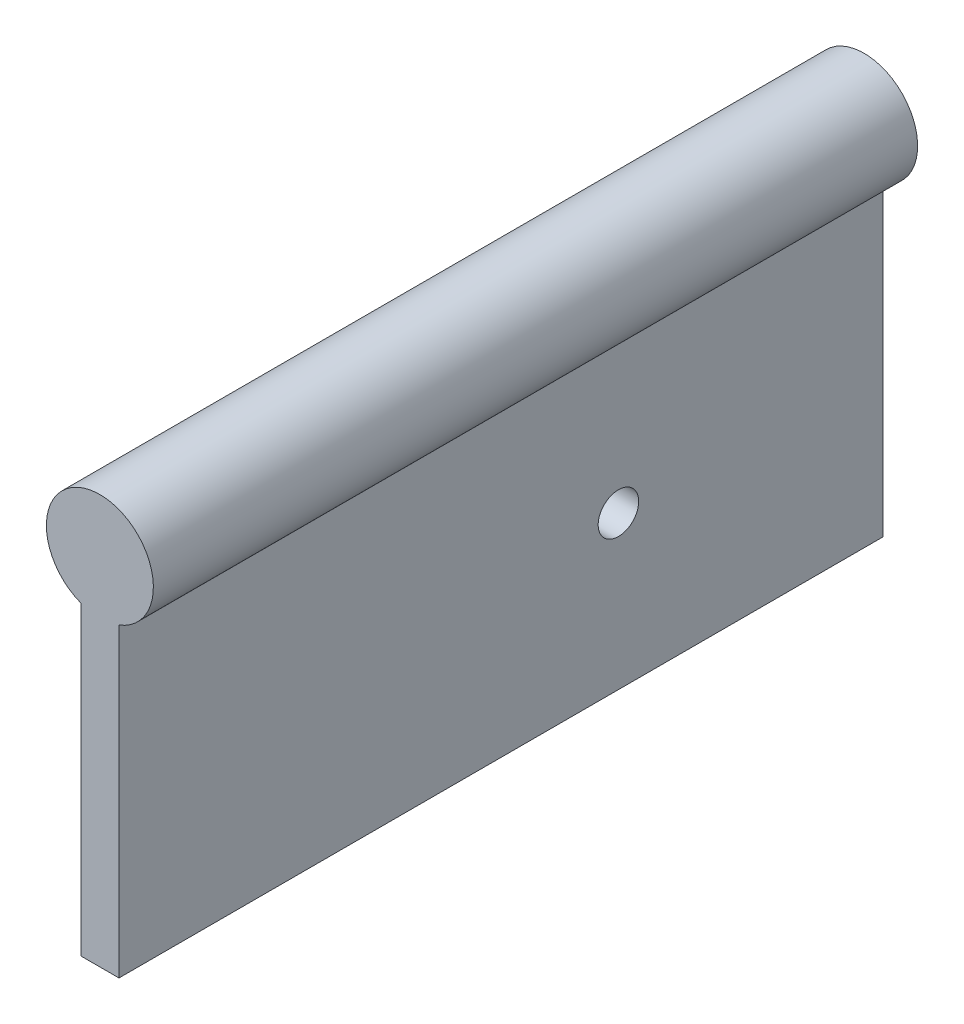
ISO-10303-21;
HEADER;
FILE_DESCRIPTION(('STEP AP214'),'2;1');
FILE_NAME('part.step','',(''),(''),'','','');
FILE_SCHEMA(('AUTOMOTIVE_DESIGN { 1 0 10303 214 1 1 1 1 }'));
ENDSEC;
DATA;
#1=APPLICATION_CONTEXT('core data for automotive mechanical design processes');
#2=APPLICATION_PROTOCOL_DEFINITION('international standard','automotive_design',2000,#1);
#3=PRODUCT_CONTEXT('',#1,'mechanical');
#4=PRODUCT('Part','Part','',(#3));
#5=PRODUCT_RELATED_PRODUCT_CATEGORY('part','',(#4));
#6=PRODUCT_DEFINITION_FORMATION('','',#4);
#7=PRODUCT_DEFINITION_CONTEXT('part definition',#1,'design');
#8=PRODUCT_DEFINITION('design','',#6,#7);
#9=PRODUCT_DEFINITION_SHAPE('','',#8);
#10=(LENGTH_UNIT() NAMED_UNIT(*) SI_UNIT(.MILLI.,.METRE.));
#11=(NAMED_UNIT(*) PLANE_ANGLE_UNIT() SI_UNIT($,.RADIAN.));
#12=(NAMED_UNIT(*) SI_UNIT($,.STERADIAN.) SOLID_ANGLE_UNIT());
#13=UNCERTAINTY_MEASURE_WITH_UNIT(LENGTH_MEASURE(1.E-05),#10,'distance_accuracy_value','');
#14=(GEOMETRIC_REPRESENTATION_CONTEXT(3) GLOBAL_UNCERTAINTY_ASSIGNED_CONTEXT((#13)) GLOBAL_UNIT_ASSIGNED_CONTEXT((#10,
#11,#12)) REPRESENTATION_CONTEXT('',''));
#15=CARTESIAN_POINT('',(0.,0.,0.));
#16=DIRECTION('',(0.,0.,1.));
#17=DIRECTION('',(1.,0.,0.));
#18=AXIS2_PLACEMENT_3D('',#15,#16,#17);
#19=CARTESIAN_POINT('',(5.,0.,-15.35));
#20=DIRECTION('',(-1.,0.,0.));
#21=DIRECTION('',(0.,0.,1.));
#22=AXIS2_PLACEMENT_3D('',#19,#20,#21);
#23=CYLINDRICAL_SURFACE('',#22,2.5);
#24=CARTESIAN_POINT('',(-0.149999999999994,0.,-15.35));
#25=DIRECTION('',(1.,0.,0.));
#26=DIRECTION('',(0.,0.,-1.));
#27=AXIS2_PLACEMENT_3D('',#24,#25,#26);
#28=CIRCLE('',#27,2.5);
#29=CARTESIAN_POINT('',(-0.149999999999994,0.,-17.85));
#30=VERTEX_POINT('',#29);
#31=EDGE_CURVE('E11',#30,#30,#28,.T.);
#32=ORIENTED_EDGE('',*,*,#31,.T.);
#33=EDGE_LOOP('',(#32));
#34=FACE_BOUND('',#33,.T.);
#35=CARTESIAN_POINT('',(-5.2,0.,-15.35));
#36=DIRECTION('',(-1.,0.,0.));
#37=DIRECTION('',(0.,0.,1.));
#38=AXIS2_PLACEMENT_3D('',#35,#36,#37);
#39=CIRCLE('',#38,2.5);
#40=CARTESIAN_POINT('',(-5.2,0.,-12.85));
#41=VERTEX_POINT('',#40);
#42=EDGE_CURVE('E155',#41,#41,#39,.T.);
#43=ORIENTED_EDGE('',*,*,#42,.T.);
#44=EDGE_LOOP('',(#43));
#45=FACE_BOUND('',#44,.T.);
#46=ADVANCED_FACE('F53',(#34,#45),#23,.F.);
#47=CARTESIAN_POINT('',(5.,0.,50.));
#48=DIRECTION('',(0.,0.,1.));
#49=DIRECTION('',(1.,0.,0.));
#50=AXIS2_PLACEMENT_3D('',#47,#48,#49);
#51=PLANE('',#50);
#52=DIRECTION('',(0.,1.,0.));
#53=VECTOR('',#52,1.);
#54=CARTESIAN_POINT('',(0.,0.,50.));
#55=LINE('',#54,#53);
#56=CARTESIAN_POINT('',(0.,-20.,50.));
#57=VERTEX_POINT('',#56);
#58=CARTESIAN_POINT('',(0.,20.,50.));
#59=VERTEX_POINT('',#58);
#60=EDGE_CURVE('E118',#57,#59,#55,.T.);
#61=ORIENTED_EDGE('',*,*,#60,.F.);
#62=DIRECTION('',(-1.,0.,0.));
#63=VECTOR('',#62,1.);
#64=CARTESIAN_POINT('',(5.,-20.,50.));
#65=LINE('',#64,#63);
#66=CARTESIAN_POINT('',(5.,-20.,50.));
#67=VERTEX_POINT('',#66);
#68=EDGE_CURVE('E64',#67,#57,#65,.T.);
#69=ORIENTED_EDGE('',*,*,#68,.F.);
#70=DIRECTION('',(0.,1.,0.));
#71=VECTOR('',#70,1.);
#72=CARTESIAN_POINT('',(5.,0.,50.));
#73=LINE('',#72,#71);
#74=CARTESIAN_POINT('',(5.,20.,50.));
#75=VERTEX_POINT('',#74);
#76=EDGE_CURVE('E142',#67,#75,#73,.T.);
#77=ORIENTED_EDGE('',*,*,#76,.T.);
#78=CARTESIAN_POINT('',(2.5,26.538348415311,50.));
#79=DIRECTION('',(0.,0.,1.));
#80=DIRECTION('',(1.,0.,0.));
#81=AXIS2_PLACEMENT_3D('',#78,#79,#80);
#82=CIRCLE('',#81,7.);
#83=EDGE_CURVE('E107',#59,#75,#82,.F.);
#84=ORIENTED_EDGE('',*,*,#83,.F.);
#85=EDGE_LOOP('',(#61,#69,#77,#84));
#86=FACE_BOUND('',#85,.T.);
#87=ADVANCED_FACE('F140',(#86),#51,.T.);
#88=CARTESIAN_POINT('',(5.,-20.,0.));
#89=DIRECTION('',(0.,1.,0.));
#90=DIRECTION('',(0.,0.,1.));
#91=AXIS2_PLACEMENT_3D('',#88,#89,#90);
#92=PLANE('',#91);
#93=DIRECTION('',(0.,0.,-1.));
#94=VECTOR('',#93,1.);
#95=CARTESIAN_POINT('',(0.,-20.,0.));
#96=LINE('',#95,#94);
#97=CARTESIAN_POINT('',(0.,-20.,-50.));
#98=VERTEX_POINT('',#97);
#99=EDGE_CURVE('E85',#57,#98,#96,.T.);
#100=ORIENTED_EDGE('',*,*,#99,.T.);
#101=DIRECTION('',(-1.,0.,0.));
#102=VECTOR('',#101,1.);
#103=CARTESIAN_POINT('',(5.,-20.,-50.));
#104=LINE('',#103,#102);
#105=CARTESIAN_POINT('',(5.,-20.,-50.));
#106=VERTEX_POINT('',#105);
#107=EDGE_CURVE('E112',#106,#98,#104,.T.);
#108=ORIENTED_EDGE('',*,*,#107,.F.);
#109=DIRECTION('',(0.,0.,-1.));
#110=VECTOR('',#109,1.);
#111=CARTESIAN_POINT('',(5.,-20.,0.));
#112=LINE('',#111,#110);
#113=EDGE_CURVE('E72',#67,#106,#112,.T.);
#114=ORIENTED_EDGE('',*,*,#113,.F.);
#115=ORIENTED_EDGE('',*,*,#68,.T.);
#116=EDGE_LOOP('',(#100,#108,#114,#115));
#117=FACE_BOUND('',#116,.T.);
#118=ADVANCED_FACE('F136',(#117),#92,.F.);
#119=CARTESIAN_POINT('',(5.,0.,-50.));
#120=DIRECTION('',(0.,0.,1.));
#121=DIRECTION('',(1.,0.,0.));
#122=AXIS2_PLACEMENT_3D('',#119,#120,#121);
#123=PLANE('',#122);
#124=DIRECTION('',(0.,1.,0.));
#125=VECTOR('',#124,1.);
#126=CARTESIAN_POINT('',(0.,0.,-50.));
#127=LINE('',#126,#125);
#128=CARTESIAN_POINT('',(0.,20.,-50.));
#129=VERTEX_POINT('',#128);
#130=EDGE_CURVE('E110',#98,#129,#127,.T.);
#131=ORIENTED_EDGE('',*,*,#130,.T.);
#132=CARTESIAN_POINT('',(2.5,26.538348415311,-50.));
#133=DIRECTION('',(0.,0.,-1.));
#134=DIRECTION('',(-1.,0.,0.));
#135=AXIS2_PLACEMENT_3D('',#132,#133,#134);
#136=CIRCLE('',#135,7.);
#137=CARTESIAN_POINT('',(5.,20.,-50.));
#138=VERTEX_POINT('',#137);
#139=EDGE_CURVE('E94',#129,#138,#136,.T.);
#140=ORIENTED_EDGE('',*,*,#139,.T.);
#141=DIRECTION('',(0.,1.,0.));
#142=VECTOR('',#141,1.);
#143=CARTESIAN_POINT('',(5.,0.,-50.));
#144=LINE('',#143,#142);
#145=EDGE_CURVE('E129',#106,#138,#144,.T.);
#146=ORIENTED_EDGE('',*,*,#145,.F.);
#147=ORIENTED_EDGE('',*,*,#107,.T.);
#148=EDGE_LOOP('',(#131,#140,#146,#147));
#149=FACE_BOUND('',#148,.T.);
#150=ADVANCED_FACE('F111',(#149),#123,.F.);
#151=CARTESIAN_POINT('',(5.,0.,0.));
#152=DIRECTION('',(1.,0.,0.));
#153=DIRECTION('',(0.,0.,-1.));
#154=AXIS2_PLACEMENT_3D('',#151,#152,#153);
#155=PLANE('',#154);
#156=CARTESIAN_POINT('',(5.,0.,-15.35));
#157=DIRECTION('',(1.,0.,0.));
#158=DIRECTION('',(0.,0.,-1.));
#159=AXIS2_PLACEMENT_3D('',#156,#157,#158);
#160=CIRCLE('',#159,2.65);
#161=CARTESIAN_POINT('',(5.,0.,-18.));
#162=VERTEX_POINT('',#161);
#163=EDGE_CURVE('E145',#162,#162,#160,.T.);
#164=ORIENTED_EDGE('',*,*,#163,.F.);
#165=EDGE_LOOP('',(#164));
#166=FACE_BOUND('',#165,.T.);
#167=DIRECTION('',(0.,0.,-1.));
#168=VECTOR('',#167,1.);
#169=CARTESIAN_POINT('',(5.,20.,0.));
#170=LINE('',#169,#168);
#171=EDGE_CURVE('E103',#75,#138,#170,.T.);
#172=ORIENTED_EDGE('',*,*,#171,.F.);
#173=ORIENTED_EDGE('',*,*,#76,.F.);
#174=ORIENTED_EDGE('',*,*,#113,.T.);
#175=ORIENTED_EDGE('',*,*,#145,.T.);
#176=EDGE_LOOP('',(#172,#173,#174,#175));
#177=FACE_BOUND('',#176,.T.);
#178=ADVANCED_FACE('F175',(#166,#177),#155,.T.);
#179=CARTESIAN_POINT('',(0.,0.,0.));
#180=DIRECTION('',(1.,0.,0.));
#181=DIRECTION('',(0.,0.,-1.));
#182=AXIS2_PLACEMENT_3D('',#179,#180,#181);
#183=PLANE('',#182);
#184=CARTESIAN_POINT('',(0.,0.,15.35));
#185=DIRECTION('',(1.,0.,0.));
#186=DIRECTION('',(0.,0.,-1.));
#187=AXIS2_PLACEMENT_3D('',#184,#185,#186);
#188=CIRCLE('',#187,4.8);
#189=CARTESIAN_POINT('',(0.,0.,10.55));
#190=VERTEX_POINT('',#189);
#191=EDGE_CURVE('E126',#190,#190,#188,.T.);
#192=ORIENTED_EDGE('',*,*,#191,.T.);
#193=EDGE_LOOP('',(#192));
#194=FACE_BOUND('',#193,.T.);
#195=CARTESIAN_POINT('',(0.,0.,-15.35));
#196=DIRECTION('',(1.,0.,0.));
#197=DIRECTION('',(0.,0.,-1.));
#198=AXIS2_PLACEMENT_3D('',#195,#196,#197);
#199=CIRCLE('',#198,4.8);
#200=CARTESIAN_POINT('',(0.,0.,-20.15));
#201=VERTEX_POINT('',#200);
#202=EDGE_CURVE('E163',#201,#201,#199,.T.);
#203=ORIENTED_EDGE('',*,*,#202,.T.);
#204=EDGE_LOOP('',(#203));
#205=FACE_BOUND('',#204,.T.);
#206=DIRECTION('',(0.,0.,-1.));
#207=VECTOR('',#206,1.);
#208=CARTESIAN_POINT('',(0.,20.,0.));
#209=LINE('',#208,#207);
#210=EDGE_CURVE('E100',#59,#129,#209,.T.);
#211=ORIENTED_EDGE('',*,*,#210,.T.);
#212=ORIENTED_EDGE('',*,*,#130,.F.);
#213=ORIENTED_EDGE('',*,*,#99,.F.);
#214=ORIENTED_EDGE('',*,*,#60,.T.);
#215=EDGE_LOOP('',(#211,#212,#213,#214));
#216=FACE_BOUND('',#215,.T.);
#217=ADVANCED_FACE('F116',(#194,#205,#216),#183,.F.);
#218=CARTESIAN_POINT('',(-5.2,0.,-15.35));
#219=DIRECTION('',(1.,0.,0.));
#220=DIRECTION('',(0.,0.,-1.));
#221=AXIS2_PLACEMENT_3D('',#218,#219,#220);
#222=CYLINDRICAL_SURFACE('',#221,4.8);
#223=CARTESIAN_POINT('',(-5.2,0.,-15.35));
#224=DIRECTION('',(1.,0.,0.));
#225=DIRECTION('',(0.,0.,-1.));
#226=AXIS2_PLACEMENT_3D('',#223,#224,#225);
#227=CIRCLE('',#226,4.8);
#228=CARTESIAN_POINT('',(-5.2,0.,-20.15));
#229=VERTEX_POINT('',#228);
#230=EDGE_CURVE('E158',#229,#229,#227,.T.);
#231=ORIENTED_EDGE('',*,*,#230,.T.);
#232=EDGE_LOOP('',(#231));
#233=FACE_BOUND('',#232,.T.);
#234=ORIENTED_EDGE('',*,*,#202,.F.);
#235=EDGE_LOOP('',(#234));
#236=FACE_BOUND('',#235,.T.);
#237=ADVANCED_FACE('F182',(#233,#236),#222,.T.);
#238=CARTESIAN_POINT('',(-5.2,0.,-15.35));
#239=DIRECTION('',(1.,0.,0.));
#240=DIRECTION('',(0.,0.,-1.));
#241=AXIS2_PLACEMENT_3D('',#238,#239,#240);
#242=PLANE('',#241);
#243=ORIENTED_EDGE('',*,*,#42,.F.);
#244=EDGE_LOOP('',(#243));
#245=FACE_BOUND('',#244,.T.);
#246=ORIENTED_EDGE('',*,*,#230,.F.);
#247=EDGE_LOOP('',(#246));
#248=FACE_BOUND('',#247,.T.);
#249=ADVANCED_FACE('F209',(#245,#248),#242,.F.);
#250=CARTESIAN_POINT('',(-5.2,0.,15.35));
#251=DIRECTION('',(1.,0.,0.));
#252=DIRECTION('',(0.,0.,-1.));
#253=AXIS2_PLACEMENT_3D('',#250,#251,#252);
#254=CYLINDRICAL_SURFACE('',#253,4.8);
#255=CARTESIAN_POINT('',(-5.2,0.,15.35));
#256=DIRECTION('',(1.,0.,0.));
#257=DIRECTION('',(0.,0.,-1.));
#258=AXIS2_PLACEMENT_3D('',#255,#256,#257);
#259=CIRCLE('',#258,4.8);
#260=CARTESIAN_POINT('',(-5.2,0.,10.55));
#261=VERTEX_POINT('',#260);
#262=EDGE_CURVE('E120',#261,#261,#259,.T.);
#263=ORIENTED_EDGE('',*,*,#262,.T.);
#264=EDGE_LOOP('',(#263));
#265=FACE_BOUND('',#264,.T.);
#266=ORIENTED_EDGE('',*,*,#191,.F.);
#267=EDGE_LOOP('',(#266));
#268=FACE_BOUND('',#267,.T.);
#269=ADVANCED_FACE('F205',(#265,#268),#254,.T.);
#270=CARTESIAN_POINT('',(-5.2,0.,15.35));
#271=DIRECTION('',(1.,0.,0.));
#272=DIRECTION('',(0.,0.,-1.));
#273=AXIS2_PLACEMENT_3D('',#270,#271,#272);
#274=PLANE('',#273);
#275=ORIENTED_EDGE('',*,*,#262,.F.);
#276=EDGE_LOOP('',(#275));
#277=FACE_BOUND('',#276,.T.);
#278=ADVANCED_FACE('F202',(#277),#274,.F.);
#279=CARTESIAN_POINT('',(-7.4953318805774,0.,-15.35));
#280=DIRECTION('',(1.,0.,0.));
#281=DIRECTION('',(0.,0.,-1.));
#282=AXIS2_PLACEMENT_3D('',#279,#280,#281);
#283=CYLINDRICAL_SURFACE('',#282,2.65);
#284=CARTESIAN_POINT('',(0.,0.,-15.35));
#285=DIRECTION('',(1.,0.,0.));
#286=DIRECTION('',(0.,0.,-1.));
#287=AXIS2_PLACEMENT_3D('',#284,#285,#286);
#288=CIRCLE('',#287,2.65);
#289=CARTESIAN_POINT('',(0.,0.,-18.));
#290=VERTEX_POINT('',#289);
#291=EDGE_CURVE('E149',#290,#290,#288,.F.);
#292=CARTESIAN_POINT('',(0.,0.,-18.));
#293=CARTESIAN_POINT('',(0.0520833333333334,0.,-18.));
#294=CARTESIAN_POINT('',(0.104166666666667,0.,-18.));
#295=CARTESIAN_POINT('',(0.208333333333334,0.,-18.));
#296=CARTESIAN_POINT('',(0.260416666666667,0.,-18.));
#297=CARTESIAN_POINT('',(0.364583333333333,0.,-18.));
#298=CARTESIAN_POINT('',(0.416666666666666,0.,-18.));
#299=CARTESIAN_POINT('',(0.520833333333333,0.,-18.));
#300=CARTESIAN_POINT('',(0.572916666666666,0.,-18.));
#301=CARTESIAN_POINT('',(0.677083333333332,0.,-18.));
#302=CARTESIAN_POINT('',(0.729166666666665,0.,-18.));
#303=CARTESIAN_POINT('',(0.833333333333331,0.,-18.));
#304=CARTESIAN_POINT('',(0.885416666666665,0.,-18.));
#305=CARTESIAN_POINT('',(0.989583333333332,0.,-18.));
#306=CARTESIAN_POINT('',(1.04166666666666,0.,-18.));
#307=CARTESIAN_POINT('',(1.14583333333333,0.,-18.));
#308=CARTESIAN_POINT('',(1.19791666666666,0.,-18.));
#309=CARTESIAN_POINT('',(1.30208333333333,0.,-18.));
#310=CARTESIAN_POINT('',(1.35416666666667,0.,-18.));
#311=CARTESIAN_POINT('',(1.45833333333333,0.,-18.));
#312=CARTESIAN_POINT('',(1.51041666666667,0.,-18.));
#313=CARTESIAN_POINT('',(1.61458333333333,0.,-18.));
#314=CARTESIAN_POINT('',(1.66666666666667,0.,-18.));
#315=CARTESIAN_POINT('',(1.77083333333333,0.,-18.));
#316=CARTESIAN_POINT('',(1.82291666666667,0.,-18.));
#317=CARTESIAN_POINT('',(1.92708333333333,0.,-18.));
#318=CARTESIAN_POINT('',(1.97916666666667,0.,-18.));
#319=CARTESIAN_POINT('',(2.08333333333333,0.,-18.));
#320=CARTESIAN_POINT('',(2.13541666666667,0.,-18.));
#321=CARTESIAN_POINT('',(2.23958333333333,0.,-18.));
#322=CARTESIAN_POINT('',(2.29166666666667,0.,-18.));
#323=CARTESIAN_POINT('',(2.39583333333333,0.,-18.));
#324=CARTESIAN_POINT('',(2.44791666666667,0.,-18.));
#325=CARTESIAN_POINT('',(2.55208333333333,0.,-18.));
#326=CARTESIAN_POINT('',(2.60416666666667,0.,-18.));
#327=CARTESIAN_POINT('',(2.70833333333333,0.,-18.));
#328=CARTESIAN_POINT('',(2.76041666666667,0.,-18.));
#329=CARTESIAN_POINT('',(2.86458333333333,0.,-18.));
#330=CARTESIAN_POINT('',(2.91666666666667,0.,-18.));
#331=CARTESIAN_POINT('',(3.02083333333333,0.,-18.));
#332=CARTESIAN_POINT('',(3.07291666666667,0.,-18.));
#333=CARTESIAN_POINT('',(3.17708333333333,0.,-18.));
#334=CARTESIAN_POINT('',(3.22916666666667,0.,-18.));
#335=CARTESIAN_POINT('',(3.33333333333333,0.,-18.));
#336=CARTESIAN_POINT('',(3.38541666666667,0.,-18.));
#337=CARTESIAN_POINT('',(3.48958333333333,0.,-18.));
#338=CARTESIAN_POINT('',(3.54166666666667,0.,-18.));
#339=CARTESIAN_POINT('',(3.64583333333333,0.,-18.));
#340=CARTESIAN_POINT('',(3.69791666666667,0.,-18.));
#341=CARTESIAN_POINT('',(3.80208333333333,0.,-18.));
#342=CARTESIAN_POINT('',(3.85416666666667,0.,-18.));
#343=CARTESIAN_POINT('',(3.95833333333333,0.,-18.));
#344=CARTESIAN_POINT('',(4.01041666666666,0.,-18.));
#345=CARTESIAN_POINT('',(4.11458333333333,0.,-18.));
#346=CARTESIAN_POINT('',(4.16666666666666,0.,-18.));
#347=CARTESIAN_POINT('',(4.27083333333333,0.,-18.));
#348=CARTESIAN_POINT('',(4.32291666666666,0.,-18.));
#349=CARTESIAN_POINT('',(4.42708333333333,0.,-18.));
#350=CARTESIAN_POINT('',(4.47916666666666,0.,-18.));
#351=CARTESIAN_POINT('',(4.58333333333333,0.,-18.));
#352=CARTESIAN_POINT('',(4.63541666666666,0.,-18.));
#353=CARTESIAN_POINT('',(4.73958333333333,0.,-18.));
#354=CARTESIAN_POINT('',(4.79166666666666,0.,-18.));
#355=CARTESIAN_POINT('',(4.89583333333333,0.,-18.));
#356=CARTESIAN_POINT('',(4.94791666666666,0.,-18.));
#357=CARTESIAN_POINT('',(5.,0.,-18.));
#358=B_SPLINE_CURVE_WITH_KNOTS('',3,(#292,#293,#294,#295,#296,#297,#298,#299,#300,#301,#302,
#303,#304,#305,#306,#307,#308,#309,#310,#311,#312,#313,#314,#315,#316,#317,#318,#319,#320,#321,
#322,#323,#324,#325,#326,#327,#328,#329,#330,#331,#332,#333,#334,#335,#336,#337,#338,#339,#340,
#341,#342,#343,#344,#345,#346,#347,#348,#349,#350,#351,#352,#353,#354,#355,#356,#357),
.UNSPECIFIED.,.F.,.F.,(4,2,2,2,2,2,2,2,2,2,2,2,2,2,2,2,2,2,2,2,2,2,2,2,2,2,2,2,2,2,2,2,4),(0.,
0.15625,0.3125,0.46875,0.625,0.781249999999998,0.937499999999998,1.09375,1.25,1.40625,1.5625,
1.71875,1.875,2.03125,2.1875,2.34375,2.5,2.65625,2.8125,2.96875,3.125,3.28125,3.4375,3.59375,
3.75,3.90625,4.0625,4.21875,4.375,4.53125,4.6875,4.84375,5.),.UNSPECIFIED.);
#359=EDGE_CURVE('BSEAM200',#290,#162,#358,.T.);
#360=ORIENTED_EDGE('',*,*,#291,.T.);
#361=ORIENTED_EDGE('',*,*,#163,.T.);
#362=ORIENTED_EDGE('',*,*,#359,.T.);
#363=ORIENTED_EDGE('',*,*,#359,.F.);
#364=EDGE_LOOP('',(#360,#362,#361,#363));
#365=FACE_BOUND('',#364,.T.);
#366=ADVANCED_FACE('F200',(#365),#283,.F.);
#367=CARTESIAN_POINT('',(0.,0.,-15.35));
#368=DIRECTION('',(1.,0.,0.));
#369=DIRECTION('',(0.,0.,-1.));
#370=AXIS2_PLACEMENT_3D('',#367,#368,#369);
#371=CONICAL_SURFACE('',#370,2.64999999999999,0.785398163397419);
#372=ORIENTED_EDGE('',*,*,#31,.F.);
#373=EDGE_LOOP('',(#372));
#374=FACE_BOUND('',#373,.T.);
#375=ORIENTED_EDGE('',*,*,#291,.F.);
#376=EDGE_LOOP('',(#375));
#377=FACE_BOUND('',#376,.T.);
#378=ADVANCED_FACE('F56',(#374,#377),#371,.F.);
#379=CARTESIAN_POINT('',(2.5,26.538348415311,69.4752889019484));
#380=DIRECTION('',(0.,0.,-1.));
#381=DIRECTION('',(-1.,0.,0.));
#382=AXIS2_PLACEMENT_3D('',#379,#380,#381);
#383=CYLINDRICAL_SURFACE('',#382,7.);
#384=ORIENTED_EDGE('',*,*,#210,.F.);
#385=ORIENTED_EDGE('',*,*,#83,.T.);
#386=ORIENTED_EDGE('',*,*,#171,.T.);
#387=ORIENTED_EDGE('',*,*,#139,.F.);
#388=EDGE_LOOP('',(#384,#385,#386,#387));
#389=FACE_BOUND('',#388,.T.);
#390=ADVANCED_FACE('F96',(#389),#383,.T.);
#391=CLOSED_SHELL('',(#46,#87,#118,#150,#178,#217,#237,#249,#269,#278,#366,#378,#390));
#392=MANIFOLD_SOLID_BREP('B2',#391);
#393=ADVANCED_BREP_SHAPE_REPRESENTATION('',(#18,#392),#14);
#394=SHAPE_DEFINITION_REPRESENTATION(#9,#393);
ENDSEC;
END-ISO-10303-21;
